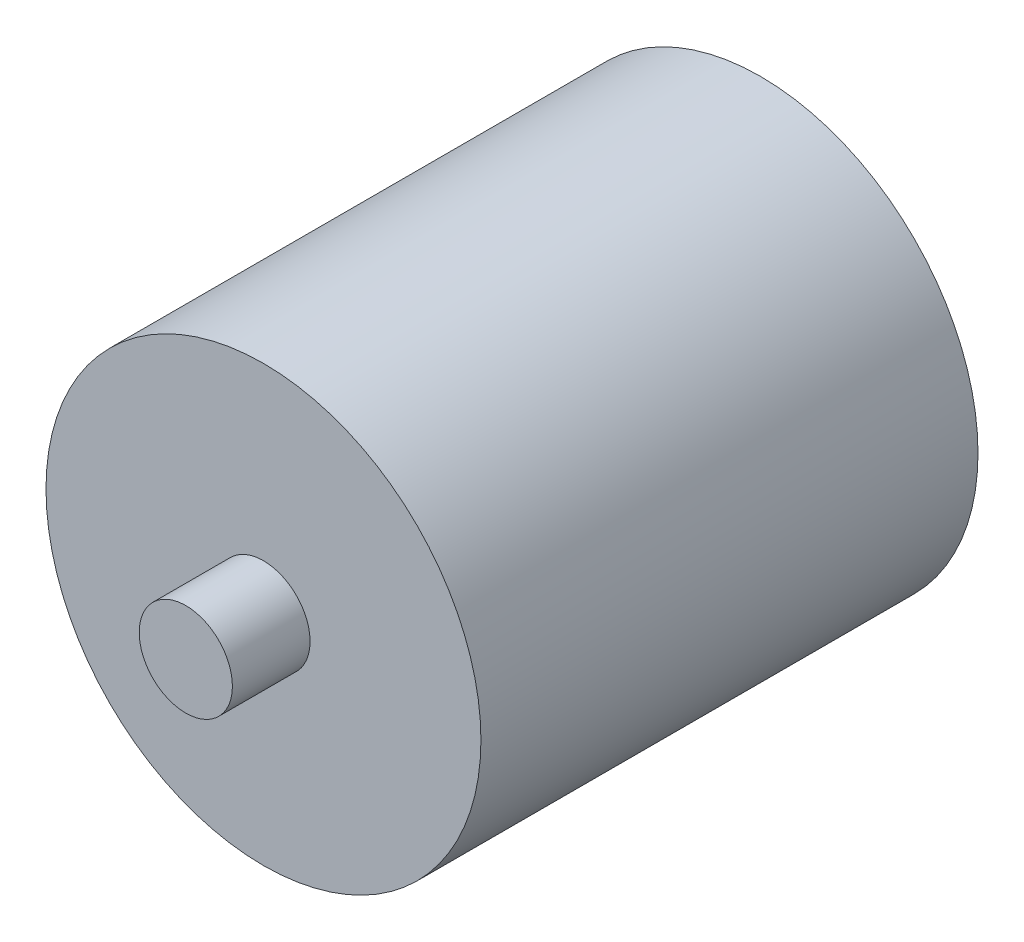
ISO-10303-21;
HEADER;
FILE_DESCRIPTION(('STEP AP214'),'2;1');
FILE_NAME('part.step','',(''),(''),'','','');
FILE_SCHEMA(('AUTOMOTIVE_DESIGN { 1 0 10303 214 1 1 1 1 }'));
ENDSEC;
DATA;
#1=APPLICATION_CONTEXT('core data for automotive mechanical design processes');
#2=APPLICATION_PROTOCOL_DEFINITION('international standard','automotive_design',2000,#1);
#3=PRODUCT_CONTEXT('',#1,'mechanical');
#4=PRODUCT('Part','Part','',(#3));
#5=PRODUCT_RELATED_PRODUCT_CATEGORY('part','',(#4));
#6=PRODUCT_DEFINITION_FORMATION('','',#4);
#7=PRODUCT_DEFINITION_CONTEXT('part definition',#1,'design');
#8=PRODUCT_DEFINITION('design','',#6,#7);
#9=PRODUCT_DEFINITION_SHAPE('','',#8);
#10=(LENGTH_UNIT() NAMED_UNIT(*) SI_UNIT(.MILLI.,.METRE.));
#11=(NAMED_UNIT(*) PLANE_ANGLE_UNIT() SI_UNIT($,.RADIAN.));
#12=(NAMED_UNIT(*) SI_UNIT($,.STERADIAN.) SOLID_ANGLE_UNIT());
#13=UNCERTAINTY_MEASURE_WITH_UNIT(LENGTH_MEASURE(1.E-05),#10,'distance_accuracy_value','');
#14=(GEOMETRIC_REPRESENTATION_CONTEXT(3) GLOBAL_UNCERTAINTY_ASSIGNED_CONTEXT((#13)) GLOBAL_UNIT_ASSIGNED_CONTEXT((#10,
#11,#12)) REPRESENTATION_CONTEXT('',''));
#15=CARTESIAN_POINT('',(0.,0.,0.));
#16=DIRECTION('',(0.,0.,1.));
#17=DIRECTION('',(1.,0.,0.));
#18=AXIS2_PLACEMENT_3D('',#15,#16,#17);
#19=CARTESIAN_POINT('',(0.,0.,32.));
#20=DIRECTION('',(0.,0.,1.));
#21=DIRECTION('',(1.,0.,0.));
#22=AXIS2_PLACEMENT_3D('',#19,#20,#21);
#23=PLANE('',#22);
#24=CARTESIAN_POINT('',(0.,0.,32.));
#25=DIRECTION('',(0.,0.,1.));
#26=DIRECTION('',(1.,0.,0.));
#27=AXIS2_PLACEMENT_3D('',#24,#25,#26);
#28=CIRCLE('',#27,14.);
#29=CARTESIAN_POINT('',(14.,0.,32.));
#30=VERTEX_POINT('',#29);
#31=EDGE_CURVE('E10',#30,#30,#28,.T.);
#32=ORIENTED_EDGE('',*,*,#31,.T.);
#33=EDGE_LOOP('',(#32));
#34=FACE_BOUND('',#33,.T.);
#35=CARTESIAN_POINT('',(0.,0.,32.));
#36=DIRECTION('',(0.,0.,1.));
#37=DIRECTION('',(1.,0.,0.));
#38=AXIS2_PLACEMENT_3D('',#35,#36,#37);
#39=CIRCLE('',#38,3.);
#40=CARTESIAN_POINT('',(3.,0.,32.));
#41=VERTEX_POINT('',#40);
#42=EDGE_CURVE('E68',#41,#41,#39,.T.);
#43=ORIENTED_EDGE('',*,*,#42,.F.);
#44=EDGE_LOOP('',(#43));
#45=FACE_BOUND('',#44,.T.);
#46=ADVANCED_FACE('F31',(#34,#45),#23,.T.);
#47=CARTESIAN_POINT('',(0.,0.,0.));
#48=DIRECTION('',(0.,0.,1.));
#49=DIRECTION('',(1.,0.,0.));
#50=AXIS2_PLACEMENT_3D('',#47,#48,#49);
#51=PLANE('',#50);
#52=CARTESIAN_POINT('',(9.5,0.,0.));
#53=DIRECTION('',(0.,0.,1.));
#54=DIRECTION('',(1.,0.,0.));
#55=AXIS2_PLACEMENT_3D('',#52,#53,#54);
#56=CIRCLE('',#55,1.5);
#57=CARTESIAN_POINT('',(11.,0.,0.));
#58=VERTEX_POINT('',#57);
#59=EDGE_CURVE('E62',#58,#58,#56,.F.);
#60=ORIENTED_EDGE('',*,*,#59,.F.);
#61=EDGE_LOOP('',(#60));
#62=FACE_BOUND('',#61,.T.);
#63=CARTESIAN_POINT('',(0.,-8.,0.));
#64=DIRECTION('',(0.,0.,1.));
#65=DIRECTION('',(1.,0.,0.));
#66=AXIS2_PLACEMENT_3D('',#63,#64,#65);
#67=CIRCLE('',#66,1.5);
#68=CARTESIAN_POINT('',(1.5,-8.,0.));
#69=VERTEX_POINT('',#68);
#70=EDGE_CURVE('E56',#69,#69,#67,.F.);
#71=ORIENTED_EDGE('',*,*,#70,.F.);
#72=EDGE_LOOP('',(#71));
#73=FACE_BOUND('',#72,.T.);
#74=CARTESIAN_POINT('',(0.,8.,0.));
#75=DIRECTION('',(0.,0.,1.));
#76=DIRECTION('',(1.,0.,0.));
#77=AXIS2_PLACEMENT_3D('',#74,#75,#76);
#78=CIRCLE('',#77,1.5);
#79=CARTESIAN_POINT('',(1.5,8.,0.));
#80=VERTEX_POINT('',#79);
#81=EDGE_CURVE('E44',#80,#80,#78,.T.);
#82=ORIENTED_EDGE('',*,*,#81,.T.);
#83=EDGE_LOOP('',(#82));
#84=FACE_BOUND('',#83,.T.);
#85=CARTESIAN_POINT('',(0.,0.,0.));
#86=DIRECTION('',(0.,0.,1.));
#87=DIRECTION('',(1.,0.,0.));
#88=AXIS2_PLACEMENT_3D('',#85,#86,#87);
#89=CIRCLE('',#88,14.);
#90=CARTESIAN_POINT('',(14.,0.,0.));
#91=VERTEX_POINT('',#90);
#92=EDGE_CURVE('E35',#91,#91,#89,.T.);
#93=ORIENTED_EDGE('',*,*,#92,.F.);
#94=EDGE_LOOP('',(#93));
#95=FACE_BOUND('',#94,.T.);
#96=CARTESIAN_POINT('',(-9.5,0.,0.));
#97=DIRECTION('',(0.,0.,1.));
#98=DIRECTION('',(1.,0.,0.));
#99=AXIS2_PLACEMENT_3D('',#96,#97,#98);
#100=CIRCLE('',#99,1.5);
#101=CARTESIAN_POINT('',(-8.,0.,0.));
#102=VERTEX_POINT('',#101);
#103=EDGE_CURVE('E50',#102,#102,#100,.T.);
#104=ORIENTED_EDGE('',*,*,#103,.T.);
#105=EDGE_LOOP('',(#104));
#106=FACE_BOUND('',#105,.T.);
#107=ADVANCED_FACE('F84',(#62,#73,#84,#95,#106),#51,.F.);
#108=CARTESIAN_POINT('',(0.,0.,32.));
#109=DIRECTION('',(0.,0.,-1.));
#110=DIRECTION('',(-1.,0.,0.));
#111=AXIS2_PLACEMENT_3D('',#108,#109,#110);
#112=CYLINDRICAL_SURFACE('',#111,14.);
#113=ORIENTED_EDGE('',*,*,#31,.F.);
#114=EDGE_LOOP('',(#113));
#115=FACE_BOUND('',#114,.T.);
#116=ORIENTED_EDGE('',*,*,#92,.T.);
#117=EDGE_LOOP('',(#116));
#118=FACE_BOUND('',#117,.T.);
#119=ADVANCED_FACE('F33',(#115,#118),#112,.T.);
#120=CARTESIAN_POINT('',(0.,8.,5.));
#121=DIRECTION('',(0.,0.,-1.));
#122=DIRECTION('',(-1.,0.,0.));
#123=AXIS2_PLACEMENT_3D('',#120,#121,#122);
#124=CYLINDRICAL_SURFACE('',#123,1.5);
#125=CARTESIAN_POINT('',(0.,8.,5.));
#126=DIRECTION('',(0.,0.,1.));
#127=DIRECTION('',(1.,0.,0.));
#128=AXIS2_PLACEMENT_3D('',#125,#126,#127);
#129=CIRCLE('',#128,1.5);
#130=CARTESIAN_POINT('',(1.5,8.,5.));
#131=VERTEX_POINT('',#130);
#132=EDGE_CURVE('E42',#131,#131,#129,.T.);
#133=ORIENTED_EDGE('',*,*,#132,.T.);
#134=EDGE_LOOP('',(#133));
#135=FACE_BOUND('',#134,.T.);
#136=ORIENTED_EDGE('',*,*,#81,.F.);
#137=EDGE_LOOP('',(#136));
#138=FACE_BOUND('',#137,.T.);
#139=ADVANCED_FACE('F93',(#135,#138),#124,.F.);
#140=CARTESIAN_POINT('',(0.,0.,5.));
#141=DIRECTION('',(0.,0.,1.));
#142=DIRECTION('',(1.,0.,0.));
#143=AXIS2_PLACEMENT_3D('',#140,#141,#142);
#144=PLANE('',#143);
#145=ORIENTED_EDGE('',*,*,#132,.F.);
#146=EDGE_LOOP('',(#145));
#147=FACE_BOUND('',#146,.T.);
#148=ADVANCED_FACE('F96',(#147),#144,.F.);
#149=CARTESIAN_POINT('',(-9.5,0.,5.));
#150=DIRECTION('',(0.,0.,-1.));
#151=DIRECTION('',(-1.,0.,0.));
#152=AXIS2_PLACEMENT_3D('',#149,#150,#151);
#153=CYLINDRICAL_SURFACE('',#152,1.5);
#154=CARTESIAN_POINT('',(-9.5,0.,5.));
#155=DIRECTION('',(0.,0.,1.));
#156=DIRECTION('',(1.,0.,0.));
#157=AXIS2_PLACEMENT_3D('',#154,#155,#156);
#158=CIRCLE('',#157,1.5);
#159=CARTESIAN_POINT('',(-8.,0.,5.));
#160=VERTEX_POINT('',#159);
#161=EDGE_CURVE('E47',#160,#160,#158,.T.);
#162=ORIENTED_EDGE('',*,*,#161,.T.);
#163=EDGE_LOOP('',(#162));
#164=FACE_BOUND('',#163,.T.);
#165=ORIENTED_EDGE('',*,*,#103,.F.);
#166=EDGE_LOOP('',(#165));
#167=FACE_BOUND('',#166,.T.);
#168=ADVANCED_FACE('F100',(#164,#167),#153,.F.);
#169=CARTESIAN_POINT('',(0.,0.,5.));
#170=DIRECTION('',(0.,0.,1.));
#171=DIRECTION('',(1.,0.,0.));
#172=AXIS2_PLACEMENT_3D('',#169,#170,#171);
#173=PLANE('',#172);
#174=ORIENTED_EDGE('',*,*,#161,.F.);
#175=EDGE_LOOP('',(#174));
#176=FACE_BOUND('',#175,.T.);
#177=ADVANCED_FACE('F104',(#176),#173,.F.);
#178=CARTESIAN_POINT('',(0.,-8.,5.));
#179=DIRECTION('',(0.,0.,-1.));
#180=DIRECTION('',(-1.,0.,0.));
#181=AXIS2_PLACEMENT_3D('',#178,#179,#180);
#182=CYLINDRICAL_SURFACE('',#181,1.5);
#183=CARTESIAN_POINT('',(0.,-8.,5.));
#184=DIRECTION('',(0.,0.,1.));
#185=DIRECTION('',(1.,0.,0.));
#186=AXIS2_PLACEMENT_3D('',#183,#184,#185);
#187=CIRCLE('',#186,1.5);
#188=CARTESIAN_POINT('',(1.5,-8.,5.));
#189=VERTEX_POINT('',#188);
#190=EDGE_CURVE('E53',#189,#189,#187,.F.);
#191=ORIENTED_EDGE('',*,*,#190,.F.);
#192=EDGE_LOOP('',(#191));
#193=FACE_BOUND('',#192,.T.);
#194=ORIENTED_EDGE('',*,*,#70,.T.);
#195=EDGE_LOOP('',(#194));
#196=FACE_BOUND('',#195,.T.);
#197=ADVANCED_FACE('F108',(#193,#196),#182,.F.);
#198=CARTESIAN_POINT('',(0.,0.,5.));
#199=DIRECTION('',(0.,0.,1.));
#200=DIRECTION('',(1.,0.,0.));
#201=AXIS2_PLACEMENT_3D('',#198,#199,#200);
#202=PLANE('',#201);
#203=ORIENTED_EDGE('',*,*,#190,.T.);
#204=EDGE_LOOP('',(#203));
#205=FACE_BOUND('',#204,.T.);
#206=ADVANCED_FACE('F112',(#205),#202,.F.);
#207=CARTESIAN_POINT('',(9.5,0.,5.));
#208=DIRECTION('',(0.,0.,-1.));
#209=DIRECTION('',(-1.,0.,0.));
#210=AXIS2_PLACEMENT_3D('',#207,#208,#209);
#211=CYLINDRICAL_SURFACE('',#210,1.5);
#212=CARTESIAN_POINT('',(9.5,0.,5.));
#213=DIRECTION('',(0.,0.,1.));
#214=DIRECTION('',(1.,0.,0.));
#215=AXIS2_PLACEMENT_3D('',#212,#213,#214);
#216=CIRCLE('',#215,1.5);
#217=CARTESIAN_POINT('',(11.,0.,5.));
#218=VERTEX_POINT('',#217);
#219=EDGE_CURVE('E59',#218,#218,#216,.F.);
#220=ORIENTED_EDGE('',*,*,#219,.F.);
#221=EDGE_LOOP('',(#220));
#222=FACE_BOUND('',#221,.T.);
#223=ORIENTED_EDGE('',*,*,#59,.T.);
#224=EDGE_LOOP('',(#223));
#225=FACE_BOUND('',#224,.T.);
#226=ADVANCED_FACE('F116',(#222,#225),#211,.F.);
#227=CARTESIAN_POINT('',(0.,0.,5.));
#228=DIRECTION('',(0.,0.,1.));
#229=DIRECTION('',(1.,0.,0.));
#230=AXIS2_PLACEMENT_3D('',#227,#228,#229);
#231=PLANE('',#230);
#232=ORIENTED_EDGE('',*,*,#219,.T.);
#233=EDGE_LOOP('',(#232));
#234=FACE_BOUND('',#233,.T.);
#235=ADVANCED_FACE('F79',(#234),#231,.F.);
#236=CARTESIAN_POINT('',(0.,0.,37.));
#237=DIRECTION('',(0.,0.,-1.));
#238=DIRECTION('',(-1.,0.,0.));
#239=AXIS2_PLACEMENT_3D('',#236,#237,#238);
#240=CYLINDRICAL_SURFACE('',#239,3.);
#241=CARTESIAN_POINT('',(0.,0.,37.));
#242=DIRECTION('',(0.,0.,1.));
#243=DIRECTION('',(1.,0.,0.));
#244=AXIS2_PLACEMENT_3D('',#241,#242,#243);
#245=CIRCLE('',#244,3.);
#246=CARTESIAN_POINT('',(3.,0.,37.));
#247=VERTEX_POINT('',#246);
#248=EDGE_CURVE('E65',#247,#247,#245,.T.);
#249=ORIENTED_EDGE('',*,*,#248,.F.);
#250=EDGE_LOOP('',(#249));
#251=FACE_BOUND('',#250,.T.);
#252=ORIENTED_EDGE('',*,*,#42,.T.);
#253=EDGE_LOOP('',(#252));
#254=FACE_BOUND('',#253,.T.);
#255=ADVANCED_FACE('F76',(#251,#254),#240,.T.);
#256=CARTESIAN_POINT('',(0.,0.,37.));
#257=DIRECTION('',(0.,0.,1.));
#258=DIRECTION('',(1.,0.,0.));
#259=AXIS2_PLACEMENT_3D('',#256,#257,#258);
#260=PLANE('',#259);
#261=ORIENTED_EDGE('',*,*,#248,.T.);
#262=EDGE_LOOP('',(#261));
#263=FACE_BOUND('',#262,.T.);
#264=ADVANCED_FACE('F74',(#263),#260,.T.);
#265=CLOSED_SHELL('',(#46,#107,#119,#139,#148,#168,#177,#197,#206,#226,#235,#255,#264));
#266=MANIFOLD_SOLID_BREP('B2',#265);
#267=ADVANCED_BREP_SHAPE_REPRESENTATION('',(#18,#266),#14);
#268=SHAPE_DEFINITION_REPRESENTATION(#9,#267);
ENDSEC;
END-ISO-10303-21;
